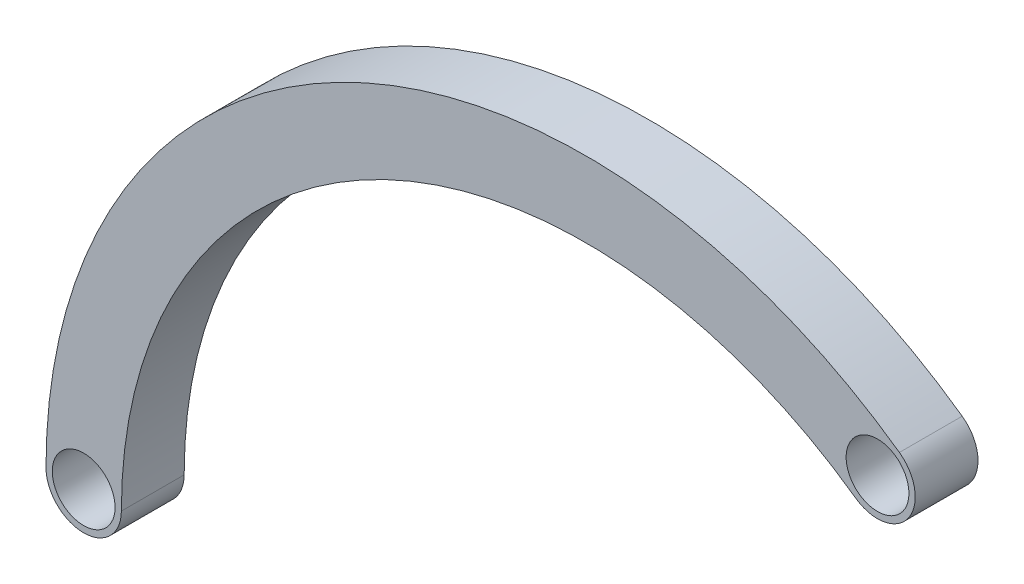
ISO-10303-21;
HEADER;
FILE_DESCRIPTION(('STEP AP214'),'2;1');
FILE_NAME('part.step','',(''),(''),'','','');
FILE_SCHEMA(('AUTOMOTIVE_DESIGN { 1 0 10303 214 1 1 1 1 }'));
ENDSEC;
DATA;
#1=APPLICATION_CONTEXT('core data for automotive mechanical design processes');
#2=APPLICATION_PROTOCOL_DEFINITION('international standard','automotive_design',2000,#1);
#3=PRODUCT_CONTEXT('',#1,'mechanical');
#4=PRODUCT('Part','Part','',(#3));
#5=PRODUCT_RELATED_PRODUCT_CATEGORY('part','',(#4));
#6=PRODUCT_DEFINITION_FORMATION('','',#4);
#7=PRODUCT_DEFINITION_CONTEXT('part definition',#1,'design');
#8=PRODUCT_DEFINITION('design','',#6,#7);
#9=PRODUCT_DEFINITION_SHAPE('','',#8);
#10=(LENGTH_UNIT() NAMED_UNIT(*) SI_UNIT(.MILLI.,.METRE.));
#11=(NAMED_UNIT(*) PLANE_ANGLE_UNIT() SI_UNIT($,.RADIAN.));
#12=(NAMED_UNIT(*) SI_UNIT($,.STERADIAN.) SOLID_ANGLE_UNIT());
#13=UNCERTAINTY_MEASURE_WITH_UNIT(LENGTH_MEASURE(1.E-05),#10,'distance_accuracy_value','');
#14=(GEOMETRIC_REPRESENTATION_CONTEXT(3) GLOBAL_UNCERTAINTY_ASSIGNED_CONTEXT((#13)) GLOBAL_UNIT_ASSIGNED_CONTEXT((#10,
#11,#12)) REPRESENTATION_CONTEXT('',''));
#15=CARTESIAN_POINT('',(0.,0.,0.));
#16=DIRECTION('',(0.,0.,1.));
#17=DIRECTION('',(1.,0.,0.));
#18=AXIS2_PLACEMENT_3D('',#15,#16,#17);
#19=CARTESIAN_POINT('',(51.6049382716059,16.2888123481185,5.));
#20=DIRECTION('',(0.,0.,1.));
#21=DIRECTION('',(1.,0.,0.));
#22=AXIS2_PLACEMENT_3D('',#19,#20,#21);
#23=PLANE('',#22);
#24=CARTESIAN_POINT('',(0.,0.,5.));
#25=DIRECTION('',(0.,0.,1.));
#26=DIRECTION('',(1.,0.,0.));
#27=AXIS2_PLACEMENT_3D('',#24,#25,#26);
#28=CIRCLE('',#27,2.50000000000009);
#29=CARTESIAN_POINT('',(2.50000000000009,0.,5.));
#30=VERTEX_POINT('',#29);
#31=EDGE_CURVE('E133',#30,#30,#28,.T.);
#32=ORIENTED_EDGE('',*,*,#31,.F.);
#33=EDGE_LOOP('',(#32));
#34=FACE_BOUND('',#33,.T.);
#35=CARTESIAN_POINT('',(63.2098765432118,32.5776246962369,5.));
#36=DIRECTION('',(0.,0.,1.));
#37=DIRECTION('',(1.,0.,0.));
#38=AXIS2_PLACEMENT_3D('',#35,#36,#37);
#39=CIRCLE('',#38,3.00000000000001);
#40=CARTESIAN_POINT('',(61.4691358024709,30.1343028440192,5.));
#41=VERTEX_POINT('',#40);
#42=CARTESIAN_POINT('',(64.9506172839527,35.0209465484547,5.));
#43=VERTEX_POINT('',#42);
#44=EDGE_CURVE('E117',#41,#43,#39,.T.);
#45=ORIENTED_EDGE('',*,*,#44,.T.);
#46=CARTESIAN_POINT('',(40.,0.,5.));
#47=DIRECTION('',(0.,0.,1.));
#48=DIRECTION('',(1.,0.,0.));
#49=AXIS2_PLACEMENT_3D('',#46,#47,#48);
#50=CIRCLE('',#49,43.);
#51=CARTESIAN_POINT('',(-3.00000000000001,0.,5.));
#52=VERTEX_POINT('',#51);
#53=EDGE_CURVE('E110',#43,#52,#50,.T.);
#54=ORIENTED_EDGE('',*,*,#53,.T.);
#55=CARTESIAN_POINT('',(0.,0.,5.));
#56=DIRECTION('',(0.,0.,1.));
#57=DIRECTION('',(1.,0.,0.));
#58=AXIS2_PLACEMENT_3D('',#55,#56,#57);
#59=CIRCLE('',#58,3.00000000000001);
#60=CARTESIAN_POINT('',(3.00000000000001,0.,5.));
#61=VERTEX_POINT('',#60);
#62=EDGE_CURVE('E116',#52,#61,#59,.T.);
#63=ORIENTED_EDGE('',*,*,#62,.T.);
#64=CARTESIAN_POINT('',(40.,0.,5.));
#65=DIRECTION('',(0.,0.,1.));
#66=DIRECTION('',(1.,0.,0.));
#67=AXIS2_PLACEMENT_3D('',#64,#65,#66);
#68=CIRCLE('',#67,37.);
#69=EDGE_CURVE('E126',#41,#61,#68,.T.);
#70=ORIENTED_EDGE('',*,*,#69,.F.);
#71=EDGE_LOOP('',(#45,#54,#63,#70));
#72=FACE_BOUND('',#71,.T.);
#73=CARTESIAN_POINT('',(63.2098765432118,32.5776246962369,5.));
#74=DIRECTION('',(0.,0.,1.));
#75=DIRECTION('',(1.,0.,0.));
#76=AXIS2_PLACEMENT_3D('',#73,#74,#75);
#77=CIRCLE('',#76,2.5);
#78=CARTESIAN_POINT('',(65.7098765432118,32.5776246962369,5.));
#79=VERTEX_POINT('',#78);
#80=EDGE_CURVE('E146',#79,#79,#77,.T.);
#81=ORIENTED_EDGE('',*,*,#80,.F.);
#82=EDGE_LOOP('',(#81));
#83=FACE_BOUND('',#82,.T.);
#84=ADVANCED_FACE('F67',(#34,#72,#83),#23,.T.);
#85=CARTESIAN_POINT('',(51.6049382716059,16.2888123481185,0.));
#86=DIRECTION('',(0.,0.,1.));
#87=DIRECTION('',(1.,0.,0.));
#88=AXIS2_PLACEMENT_3D('',#85,#86,#87);
#89=PLANE('',#88);
#90=CARTESIAN_POINT('',(63.2098765432118,32.5776246962369,0.));
#91=DIRECTION('',(0.,0.,1.));
#92=DIRECTION('',(1.,0.,0.));
#93=AXIS2_PLACEMENT_3D('',#90,#91,#92);
#94=CIRCLE('',#93,3.00000000000001);
#95=CARTESIAN_POINT('',(61.4691358024709,30.1343028440192,0.));
#96=VERTEX_POINT('',#95);
#97=CARTESIAN_POINT('',(64.9506172839527,35.0209465484547,0.));
#98=VERTEX_POINT('',#97);
#99=EDGE_CURVE('E131',#96,#98,#94,.T.);
#100=ORIENTED_EDGE('',*,*,#99,.F.);
#101=CARTESIAN_POINT('',(40.,0.,0.));
#102=DIRECTION('',(0.,0.,1.));
#103=DIRECTION('',(1.,0.,0.));
#104=AXIS2_PLACEMENT_3D('',#101,#102,#103);
#105=CIRCLE('',#104,37.);
#106=CARTESIAN_POINT('',(3.00000000000001,0.,0.));
#107=VERTEX_POINT('',#106);
#108=EDGE_CURVE('E137',#96,#107,#105,.T.);
#109=ORIENTED_EDGE('',*,*,#108,.T.);
#110=CARTESIAN_POINT('',(0.,0.,0.));
#111=DIRECTION('',(0.,0.,1.));
#112=DIRECTION('',(1.,0.,0.));
#113=AXIS2_PLACEMENT_3D('',#110,#111,#112);
#114=CIRCLE('',#113,3.00000000000001);
#115=CARTESIAN_POINT('',(-3.00000000000001,0.,0.));
#116=VERTEX_POINT('',#115);
#117=EDGE_CURVE('E135',#116,#107,#114,.T.);
#118=ORIENTED_EDGE('',*,*,#117,.F.);
#119=CARTESIAN_POINT('',(40.,0.,0.));
#120=DIRECTION('',(0.,0.,1.));
#121=DIRECTION('',(1.,0.,0.));
#122=AXIS2_PLACEMENT_3D('',#119,#120,#121);
#123=CIRCLE('',#122,43.);
#124=EDGE_CURVE('E122',#98,#116,#123,.T.);
#125=ORIENTED_EDGE('',*,*,#124,.F.);
#126=EDGE_LOOP('',(#100,#109,#118,#125));
#127=FACE_BOUND('',#126,.T.);
#128=CARTESIAN_POINT('',(0.,0.,0.));
#129=DIRECTION('',(0.,0.,1.));
#130=DIRECTION('',(1.,0.,0.));
#131=AXIS2_PLACEMENT_3D('',#128,#129,#130);
#132=CIRCLE('',#131,2.50000000000009);
#133=CARTESIAN_POINT('',(2.50000000000009,0.,0.));
#134=VERTEX_POINT('',#133);
#135=EDGE_CURVE('E143',#134,#134,#132,.T.);
#136=ORIENTED_EDGE('',*,*,#135,.T.);
#137=EDGE_LOOP('',(#136));
#138=FACE_BOUND('',#137,.T.);
#139=CARTESIAN_POINT('',(63.2098765432118,32.5776246962369,0.));
#140=DIRECTION('',(0.,0.,1.));
#141=DIRECTION('',(1.,0.,0.));
#142=AXIS2_PLACEMENT_3D('',#139,#140,#141);
#143=CIRCLE('',#142,2.5);
#144=CARTESIAN_POINT('',(65.7098765432118,32.5776246962369,0.));
#145=VERTEX_POINT('',#144);
#146=EDGE_CURVE('E149',#145,#145,#143,.T.);
#147=ORIENTED_EDGE('',*,*,#146,.T.);
#148=EDGE_LOOP('',(#147));
#149=FACE_BOUND('',#148,.T.);
#150=ADVANCED_FACE('F158',(#127,#138,#149),#89,.F.);
#151=CARTESIAN_POINT('',(63.2098765432118,32.5776246962369,5.));
#152=DIRECTION('',(0.,0.,-1.));
#153=DIRECTION('',(-1.,0.,0.));
#154=AXIS2_PLACEMENT_3D('',#151,#152,#153);
#155=CYLINDRICAL_SURFACE('',#154,3.00000000000001);
#156=ORIENTED_EDGE('',*,*,#99,.T.);
#157=DIRECTION('',(0.,0.,-1.));
#158=VECTOR('',#157,1.);
#159=CARTESIAN_POINT('',(64.9506172839527,35.0209465484547,5.));
#160=LINE('',#159,#158);
#161=EDGE_CURVE('E12',#43,#98,#160,.T.);
#162=ORIENTED_EDGE('',*,*,#161,.F.);
#163=ORIENTED_EDGE('',*,*,#44,.F.);
#164=DIRECTION('',(0.,0.,-1.));
#165=VECTOR('',#164,1.);
#166=CARTESIAN_POINT('',(61.4691358024709,30.1343028440192,5.));
#167=LINE('',#166,#165);
#168=EDGE_CURVE('E84',#41,#96,#167,.T.);
#169=ORIENTED_EDGE('',*,*,#168,.T.);
#170=EDGE_LOOP('',(#156,#162,#163,#169));
#171=FACE_BOUND('',#170,.T.);
#172=ADVANCED_FACE('F69',(#171),#155,.T.);
#173=CARTESIAN_POINT('',(40.,0.,5.));
#174=DIRECTION('',(0.,0.,-1.));
#175=DIRECTION('',(-1.,0.,0.));
#176=AXIS2_PLACEMENT_3D('',#173,#174,#175);
#177=CYLINDRICAL_SURFACE('',#176,43.);
#178=ORIENTED_EDGE('',*,*,#124,.T.);
#179=DIRECTION('',(0.,0.,-1.));
#180=VECTOR('',#179,1.);
#181=CARTESIAN_POINT('',(-3.00000000000001,0.,5.));
#182=LINE('',#181,#180);
#183=EDGE_CURVE('E76',#52,#116,#182,.T.);
#184=ORIENTED_EDGE('',*,*,#183,.F.);
#185=ORIENTED_EDGE('',*,*,#53,.F.);
#186=ORIENTED_EDGE('',*,*,#161,.T.);
#187=EDGE_LOOP('',(#178,#184,#185,#186));
#188=FACE_BOUND('',#187,.T.);
#189=ADVANCED_FACE('F121',(#188),#177,.T.);
#190=CARTESIAN_POINT('',(0.,0.,5.));
#191=DIRECTION('',(0.,0.,-1.));
#192=DIRECTION('',(-1.,0.,0.));
#193=AXIS2_PLACEMENT_3D('',#190,#191,#192);
#194=CYLINDRICAL_SURFACE('',#193,3.00000000000001);
#195=ORIENTED_EDGE('',*,*,#117,.T.);
#196=DIRECTION('',(0.,0.,-1.));
#197=VECTOR('',#196,1.);
#198=CARTESIAN_POINT('',(3.00000000000001,0.,5.));
#199=LINE('',#198,#197);
#200=EDGE_CURVE('E99',#61,#107,#199,.T.);
#201=ORIENTED_EDGE('',*,*,#200,.F.);
#202=ORIENTED_EDGE('',*,*,#62,.F.);
#203=ORIENTED_EDGE('',*,*,#183,.T.);
#204=EDGE_LOOP('',(#195,#201,#202,#203));
#205=FACE_BOUND('',#204,.T.);
#206=ADVANCED_FACE('F125',(#205),#194,.T.);
#207=CARTESIAN_POINT('',(40.,0.,5.));
#208=DIRECTION('',(0.,0.,-1.));
#209=DIRECTION('',(-1.,0.,0.));
#210=AXIS2_PLACEMENT_3D('',#207,#208,#209);
#211=CYLINDRICAL_SURFACE('',#210,37.);
#212=ORIENTED_EDGE('',*,*,#108,.F.);
#213=ORIENTED_EDGE('',*,*,#168,.F.);
#214=ORIENTED_EDGE('',*,*,#69,.T.);
#215=ORIENTED_EDGE('',*,*,#200,.T.);
#216=EDGE_LOOP('',(#212,#213,#214,#215));
#217=FACE_BOUND('',#216,.T.);
#218=ADVANCED_FACE('F170',(#217),#211,.F.);
#219=CARTESIAN_POINT('',(0.,0.,5.));
#220=DIRECTION('',(0.,0.,-1.));
#221=DIRECTION('',(-1.,0.,0.));
#222=AXIS2_PLACEMENT_3D('',#219,#220,#221);
#223=CYLINDRICAL_SURFACE('',#222,2.50000000000009);
#224=ORIENTED_EDGE('',*,*,#31,.T.);
#225=EDGE_LOOP('',(#224));
#226=FACE_BOUND('',#225,.T.);
#227=ORIENTED_EDGE('',*,*,#135,.F.);
#228=EDGE_LOOP('',(#227));
#229=FACE_BOUND('',#228,.T.);
#230=ADVANCED_FACE('F167',(#226,#229),#223,.F.);
#231=CARTESIAN_POINT('',(63.2098765432118,32.5776246962369,5.));
#232=DIRECTION('',(0.,0.,-1.));
#233=DIRECTION('',(-1.,0.,0.));
#234=AXIS2_PLACEMENT_3D('',#231,#232,#233);
#235=CYLINDRICAL_SURFACE('',#234,2.5);
#236=ORIENTED_EDGE('',*,*,#80,.T.);
#237=EDGE_LOOP('',(#236));
#238=FACE_BOUND('',#237,.T.);
#239=ORIENTED_EDGE('',*,*,#146,.F.);
#240=EDGE_LOOP('',(#239));
#241=FACE_BOUND('',#240,.T.);
#242=ADVANCED_FACE('F155',(#238,#241),#235,.F.);
#243=CLOSED_SHELL('',(#84,#150,#172,#189,#206,#218,#230,#242));
#244=MANIFOLD_SOLID_BREP('B2',#243);
#245=ADVANCED_BREP_SHAPE_REPRESENTATION('',(#18,#244),#14);
#246=SHAPE_DEFINITION_REPRESENTATION(#9,#245);
ENDSEC;
END-ISO-10303-21;
